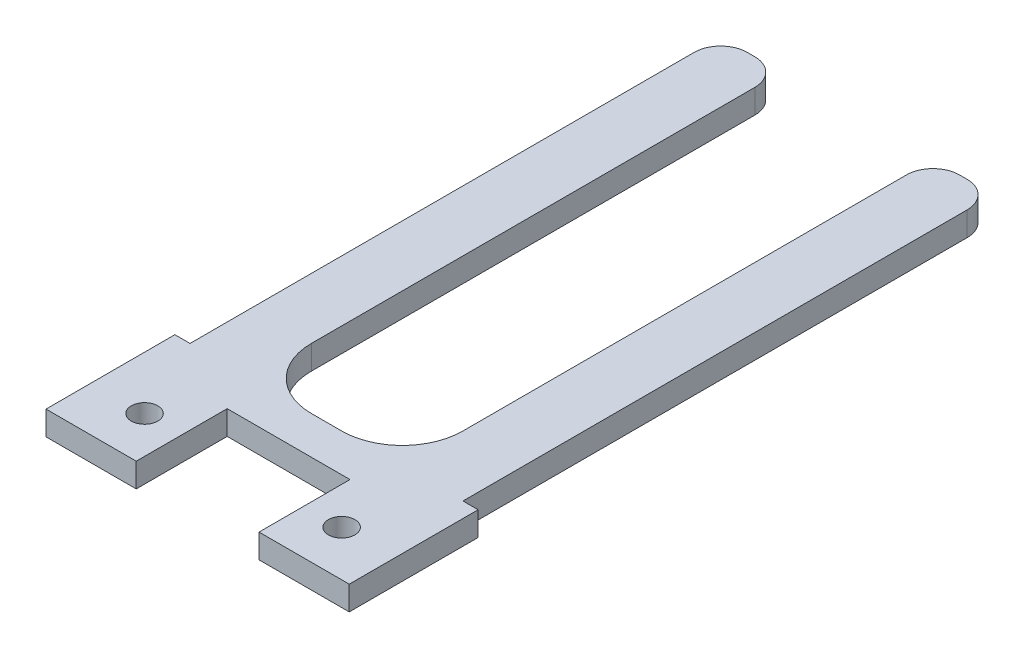
ISO-10303-21;
HEADER;
FILE_DESCRIPTION(('STEP AP214'),'2;1');
FILE_NAME('part.step','',(''),(''),'','','');
FILE_SCHEMA(('AUTOMOTIVE_DESIGN { 1 0 10303 214 1 1 1 1 }'));
ENDSEC;
DATA;
#1=APPLICATION_CONTEXT('core data for automotive mechanical design processes');
#2=APPLICATION_PROTOCOL_DEFINITION('international standard','automotive_design',2000,#1);
#3=PRODUCT_CONTEXT('',#1,'mechanical');
#4=PRODUCT('Part','Part','',(#3));
#5=PRODUCT_RELATED_PRODUCT_CATEGORY('part','',(#4));
#6=PRODUCT_DEFINITION_FORMATION('','',#4);
#7=PRODUCT_DEFINITION_CONTEXT('part definition',#1,'design');
#8=PRODUCT_DEFINITION('design','',#6,#7);
#9=PRODUCT_DEFINITION_SHAPE('','',#8);
#10=(LENGTH_UNIT() NAMED_UNIT(*) SI_UNIT(.MILLI.,.METRE.));
#11=(NAMED_UNIT(*) PLANE_ANGLE_UNIT() SI_UNIT($,.RADIAN.));
#12=(NAMED_UNIT(*) SI_UNIT($,.STERADIAN.) SOLID_ANGLE_UNIT());
#13=UNCERTAINTY_MEASURE_WITH_UNIT(LENGTH_MEASURE(1.E-05),#10,'distance_accuracy_value','');
#14=(GEOMETRIC_REPRESENTATION_CONTEXT(3) GLOBAL_UNCERTAINTY_ASSIGNED_CONTEXT((#13)) GLOBAL_UNIT_ASSIGNED_CONTEXT((#10,
#11,#12)) REPRESENTATION_CONTEXT('',''));
#15=CARTESIAN_POINT('',(0.,0.,0.));
#16=DIRECTION('',(0.,0.,1.));
#17=DIRECTION('',(1.,0.,0.));
#18=AXIS2_PLACEMENT_3D('',#15,#16,#17);
#19=CARTESIAN_POINT('',(14.5,1.5875,-71.5));
#20=DIRECTION('',(0.,-1.,0.));
#21=DIRECTION('',(0.,0.,-1.));
#22=AXIS2_PLACEMENT_3D('',#19,#20,#21);
#23=CYLINDRICAL_SURFACE('',#22,3.5);
#24=CARTESIAN_POINT('',(14.5,-1.5875,-71.5));
#25=DIRECTION('',(0.,1.,0.));
#26=DIRECTION('',(0.,0.,1.));
#27=AXIS2_PLACEMENT_3D('',#24,#25,#26);
#28=CIRCLE('',#27,3.5);
#29=CARTESIAN_POINT('',(14.5,-1.5875,-75.));
#30=VERTEX_POINT('',#29);
#31=CARTESIAN_POINT('',(18.,-1.5875,-71.5));
#32=VERTEX_POINT('',#31);
#33=EDGE_CURVE('E193',#30,#32,#28,.F.);
#34=ORIENTED_EDGE('',*,*,#33,.F.);
#35=DIRECTION('',(0.,-1.,0.));
#36=VECTOR('',#35,1.);
#37=CARTESIAN_POINT('',(14.5,1.5875,-75.));
#38=LINE('',#37,#36);
#39=CARTESIAN_POINT('',(14.5,1.5875,-75.));
#40=VERTEX_POINT('',#39);
#41=EDGE_CURVE('E188',#40,#30,#38,.T.);
#42=ORIENTED_EDGE('',*,*,#41,.F.);
#43=CARTESIAN_POINT('',(14.5,1.5875,-71.5));
#44=DIRECTION('',(0.,1.,0.));
#45=DIRECTION('',(0.,0.,1.));
#46=AXIS2_PLACEMENT_3D('',#43,#44,#45);
#47=CIRCLE('',#46,3.5);
#48=CARTESIAN_POINT('',(18.,1.5875,-71.5));
#49=VERTEX_POINT('',#48);
#50=EDGE_CURVE('E191',#40,#49,#47,.F.);
#51=ORIENTED_EDGE('',*,*,#50,.T.);
#52=DIRECTION('',(0.,-1.,0.));
#53=VECTOR('',#52,1.);
#54=CARTESIAN_POINT('',(18.,1.5875,-71.5));
#55=LINE('',#54,#53);
#56=EDGE_CURVE('E269',#49,#32,#55,.T.);
#57=ORIENTED_EDGE('',*,*,#56,.T.);
#58=EDGE_LOOP('',(#34,#42,#51,#57));
#59=FACE_BOUND('',#58,.T.);
#60=ADVANCED_FACE('F39',(#59),#23,.T.);
#61=CARTESIAN_POINT('',(0.,1.5875,-75.));
#62=DIRECTION('',(0.,0.,1.));
#63=DIRECTION('',(1.,0.,0.));
#64=AXIS2_PLACEMENT_3D('',#61,#62,#63);
#65=PLANE('',#64);
#66=DIRECTION('',(-1.,0.,0.));
#67=VECTOR('',#66,1.);
#68=CARTESIAN_POINT('',(0.,-1.5875,-75.));
#69=LINE('',#68,#67);
#70=CARTESIAN_POINT('',(13.5,-1.5875,-75.));
#71=VERTEX_POINT('',#70);
#72=EDGE_CURVE('E271',#30,#71,#69,.T.);
#73=ORIENTED_EDGE('',*,*,#72,.T.);
#74=DIRECTION('',(0.,-1.,0.));
#75=VECTOR('',#74,1.);
#76=CARTESIAN_POINT('',(13.5,1.5875,-75.));
#77=LINE('',#76,#75);
#78=CARTESIAN_POINT('',(13.5,1.5875,-75.));
#79=VERTEX_POINT('',#78);
#80=EDGE_CURVE('E198',#79,#71,#77,.T.);
#81=ORIENTED_EDGE('',*,*,#80,.F.);
#82=DIRECTION('',(-1.,0.,0.));
#83=VECTOR('',#82,1.);
#84=CARTESIAN_POINT('',(0.,1.5875,-75.));
#85=LINE('',#84,#83);
#86=EDGE_CURVE('E201',#40,#79,#85,.T.);
#87=ORIENTED_EDGE('',*,*,#86,.F.);
#88=ORIENTED_EDGE('',*,*,#41,.T.);
#89=EDGE_LOOP('',(#73,#81,#87,#88));
#90=FACE_BOUND('',#89,.T.);
#91=ADVANCED_FACE('F202',(#90),#65,.F.);
#92=CARTESIAN_POINT('',(13.5,1.5875,-71.5));
#93=DIRECTION('',(0.,-1.,0.));
#94=DIRECTION('',(0.,0.,-1.));
#95=AXIS2_PLACEMENT_3D('',#92,#93,#94);
#96=CYLINDRICAL_SURFACE('',#95,3.5);
#97=CARTESIAN_POINT('',(13.5,-1.5875,-71.5));
#98=DIRECTION('',(0.,1.,0.));
#99=DIRECTION('',(0.,0.,1.));
#100=AXIS2_PLACEMENT_3D('',#97,#98,#99);
#101=CIRCLE('',#100,3.5);
#102=CARTESIAN_POINT('',(9.99999999999998,-1.5875,-71.5));
#103=VERTEX_POINT('',#102);
#104=EDGE_CURVE('E273',#103,#71,#101,.F.);
#105=ORIENTED_EDGE('',*,*,#104,.F.);
#106=DIRECTION('',(0.,-1.,0.));
#107=VECTOR('',#106,1.);
#108=CARTESIAN_POINT('',(9.99999999999998,1.5875,-71.5));
#109=LINE('',#108,#107);
#110=CARTESIAN_POINT('',(9.99999999999998,1.5875,-71.5));
#111=VERTEX_POINT('',#110);
#112=EDGE_CURVE('E358',#111,#103,#109,.T.);
#113=ORIENTED_EDGE('',*,*,#112,.F.);
#114=CARTESIAN_POINT('',(13.5,1.5875,-71.5));
#115=DIRECTION('',(0.,1.,0.));
#116=DIRECTION('',(0.,0.,1.));
#117=AXIS2_PLACEMENT_3D('',#114,#115,#116);
#118=CIRCLE('',#117,3.5);
#119=EDGE_CURVE('E205',#111,#79,#118,.F.);
#120=ORIENTED_EDGE('',*,*,#119,.T.);
#121=ORIENTED_EDGE('',*,*,#80,.T.);
#122=EDGE_LOOP('',(#105,#113,#120,#121));
#123=FACE_BOUND('',#122,.T.);
#124=ADVANCED_FACE('F444',(#123),#96,.T.);
#125=CARTESIAN_POINT('',(9.99999999999999,1.5875,0.));
#126=DIRECTION('',(1.,0.,0.));
#127=DIRECTION('',(0.,0.,-1.));
#128=AXIS2_PLACEMENT_3D('',#125,#126,#127);
#129=PLANE('',#128);
#130=DIRECTION('',(0.,0.,1.));
#131=VECTOR('',#130,1.);
#132=CARTESIAN_POINT('',(9.99999999999999,-1.5875,0.));
#133=LINE('',#132,#131);
#134=CARTESIAN_POINT('',(9.99999999999999,-1.5875,-13.));
#135=VERTEX_POINT('',#134);
#136=EDGE_CURVE('E276',#103,#135,#133,.T.);
#137=ORIENTED_EDGE('',*,*,#136,.T.);
#138=DIRECTION('',(0.,-1.,0.));
#139=VECTOR('',#138,1.);
#140=CARTESIAN_POINT('',(9.99999999999999,1.5875,-13.));
#141=LINE('',#140,#139);
#142=CARTESIAN_POINT('',(9.99999999999999,1.5875,-13.));
#143=VERTEX_POINT('',#142);
#144=EDGE_CURVE('E365',#135,#143,#141,.F.);
#145=ORIENTED_EDGE('',*,*,#144,.T.);
#146=DIRECTION('',(0.,0.,1.));
#147=VECTOR('',#146,1.);
#148=CARTESIAN_POINT('',(9.99999999999999,1.5875,0.));
#149=LINE('',#148,#147);
#150=EDGE_CURVE('E219',#111,#143,#149,.T.);
#151=ORIENTED_EDGE('',*,*,#150,.F.);
#152=ORIENTED_EDGE('',*,*,#112,.T.);
#153=EDGE_LOOP('',(#137,#145,#151,#152));
#154=FACE_BOUND('',#153,.T.);
#155=ADVANCED_FACE('F451',(#154),#129,.F.);
#156=CARTESIAN_POINT('',(0.,1.5875,-5.00000000000001));
#157=DIRECTION('',(0.,0.,-1.));
#158=DIRECTION('',(-1.,0.,0.));
#159=AXIS2_PLACEMENT_3D('',#156,#157,#158);
#160=PLANE('',#159);
#161=DIRECTION('',(1.,0.,0.));
#162=VECTOR('',#161,1.);
#163=CARTESIAN_POINT('',(0.,1.5875,-5.00000000000001));
#164=LINE('',#163,#162);
#165=CARTESIAN_POINT('',(-1.99999999999999,1.5875,-5.00000000000001));
#166=VERTEX_POINT('',#165);
#167=CARTESIAN_POINT('',(1.99999999999999,1.5875,-5.00000000000001));
#168=VERTEX_POINT('',#167);
#169=EDGE_CURVE('E222',#166,#168,#164,.T.);
#170=ORIENTED_EDGE('',*,*,#169,.T.);
#171=DIRECTION('',(0.,-1.,0.));
#172=VECTOR('',#171,1.);
#173=CARTESIAN_POINT('',(1.99999999999999,1.5875,-5.00000000000001));
#174=LINE('',#173,#172);
#175=CARTESIAN_POINT('',(1.99999999999999,-1.5875,-5.00000000000001));
#176=VERTEX_POINT('',#175);
#177=EDGE_CURVE('E362',#168,#176,#174,.T.);
#178=ORIENTED_EDGE('',*,*,#177,.T.);
#179=DIRECTION('',(1.,0.,0.));
#180=VECTOR('',#179,1.);
#181=CARTESIAN_POINT('',(0.,-1.5875,-5.00000000000001));
#182=LINE('',#181,#180);
#183=CARTESIAN_POINT('',(-1.99999999999999,-1.5875,-5.00000000000001));
#184=VERTEX_POINT('',#183);
#185=EDGE_CURVE('E279',#184,#176,#182,.T.);
#186=ORIENTED_EDGE('',*,*,#185,.F.);
#187=DIRECTION('',(0.,-1.,0.));
#188=VECTOR('',#187,1.);
#189=CARTESIAN_POINT('',(-1.99999999999999,1.5875,-5.00000000000001));
#190=LINE('',#189,#188);
#191=EDGE_CURVE('E197',#184,#166,#190,.F.);
#192=ORIENTED_EDGE('',*,*,#191,.T.);
#193=EDGE_LOOP('',(#170,#178,#186,#192));
#194=FACE_BOUND('',#193,.T.);
#195=ADVANCED_FACE('F378',(#194),#160,.T.);
#196=CARTESIAN_POINT('',(-9.99999999999999,1.5875,0.));
#197=DIRECTION('',(1.,0.,0.));
#198=DIRECTION('',(0.,0.,-1.));
#199=AXIS2_PLACEMENT_3D('',#196,#197,#198);
#200=PLANE('',#199);
#201=DIRECTION('',(0.,0.,1.));
#202=VECTOR('',#201,1.);
#203=CARTESIAN_POINT('',(-9.99999999999999,1.5875,0.));
#204=LINE('',#203,#202);
#205=CARTESIAN_POINT('',(-9.99999999999999,1.5875,-71.5));
#206=VERTEX_POINT('',#205);
#207=CARTESIAN_POINT('',(-9.99999999999999,1.5875,-13.));
#208=VERTEX_POINT('',#207);
#209=EDGE_CURVE('E225',#206,#208,#204,.T.);
#210=ORIENTED_EDGE('',*,*,#209,.T.);
#211=DIRECTION('',(0.,-1.,0.));
#212=VECTOR('',#211,1.);
#213=CARTESIAN_POINT('',(-9.99999999999999,-1.5875,-13.));
#214=LINE('',#213,#212);
#215=CARTESIAN_POINT('',(-9.99999999999999,-1.5875,-13.));
#216=VERTEX_POINT('',#215);
#217=EDGE_CURVE('E367',#208,#216,#214,.T.);
#218=ORIENTED_EDGE('',*,*,#217,.T.);
#219=DIRECTION('',(0.,0.,1.));
#220=VECTOR('',#219,1.);
#221=CARTESIAN_POINT('',(-9.99999999999999,-1.5875,0.));
#222=LINE('',#221,#220);
#223=CARTESIAN_POINT('',(-9.99999999999999,-1.5875,-71.5));
#224=VERTEX_POINT('',#223);
#225=EDGE_CURVE('E282',#224,#216,#222,.T.);
#226=ORIENTED_EDGE('',*,*,#225,.F.);
#227=DIRECTION('',(0.,-1.,0.));
#228=VECTOR('',#227,1.);
#229=CARTESIAN_POINT('',(-9.99999999999999,1.5875,-71.5));
#230=LINE('',#229,#228);
#231=EDGE_CURVE('E356',#206,#224,#230,.T.);
#232=ORIENTED_EDGE('',*,*,#231,.F.);
#233=EDGE_LOOP('',(#210,#218,#226,#232));
#234=FACE_BOUND('',#233,.T.);
#235=ADVANCED_FACE('F381',(#234),#200,.T.);
#236=CARTESIAN_POINT('',(-13.5,1.5875,-71.5));
#237=DIRECTION('',(0.,-1.,0.));
#238=DIRECTION('',(0.,0.,-1.));
#239=AXIS2_PLACEMENT_3D('',#236,#237,#238);
#240=CYLINDRICAL_SURFACE('',#239,3.5);
#241=CARTESIAN_POINT('',(-13.5,-1.5875,-71.5));
#242=DIRECTION('',(0.,1.,0.));
#243=DIRECTION('',(0.,0.,1.));
#244=AXIS2_PLACEMENT_3D('',#241,#242,#243);
#245=CIRCLE('',#244,3.5);
#246=CARTESIAN_POINT('',(-13.5,-1.5875,-75.));
#247=VERTEX_POINT('',#246);
#248=EDGE_CURVE('E285',#247,#224,#245,.F.);
#249=ORIENTED_EDGE('',*,*,#248,.F.);
#250=DIRECTION('',(0.,-1.,0.));
#251=VECTOR('',#250,1.);
#252=CARTESIAN_POINT('',(-13.5,1.5875,-75.));
#253=LINE('',#252,#251);
#254=CARTESIAN_POINT('',(-13.5,1.5875,-75.));
#255=VERTEX_POINT('',#254);
#256=EDGE_CURVE('E354',#255,#247,#253,.T.);
#257=ORIENTED_EDGE('',*,*,#256,.F.);
#258=CARTESIAN_POINT('',(-13.5,1.5875,-71.5));
#259=DIRECTION('',(0.,1.,0.));
#260=DIRECTION('',(0.,0.,1.));
#261=AXIS2_PLACEMENT_3D('',#258,#259,#260);
#262=CIRCLE('',#261,3.5);
#263=EDGE_CURVE('E227',#255,#206,#262,.F.);
#264=ORIENTED_EDGE('',*,*,#263,.T.);
#265=ORIENTED_EDGE('',*,*,#231,.T.);
#266=EDGE_LOOP('',(#249,#257,#264,#265));
#267=FACE_BOUND('',#266,.T.);
#268=ADVANCED_FACE('F386',(#267),#240,.T.);
#269=CARTESIAN_POINT('',(0.,1.5875,-75.));
#270=DIRECTION('',(0.,0.,-1.));
#271=DIRECTION('',(-1.,0.,0.));
#272=AXIS2_PLACEMENT_3D('',#269,#270,#271);
#273=PLANE('',#272);
#274=DIRECTION('',(1.,0.,0.));
#275=VECTOR('',#274,1.);
#276=CARTESIAN_POINT('',(0.,-1.5875,-75.));
#277=LINE('',#276,#275);
#278=CARTESIAN_POINT('',(-14.5,-1.5875,-75.));
#279=VERTEX_POINT('',#278);
#280=EDGE_CURVE('E288',#279,#247,#277,.T.);
#281=ORIENTED_EDGE('',*,*,#280,.F.);
#282=DIRECTION('',(0.,-1.,0.));
#283=VECTOR('',#282,1.);
#284=CARTESIAN_POINT('',(-14.5,1.5875,-75.));
#285=LINE('',#284,#283);
#286=CARTESIAN_POINT('',(-14.5,1.5875,-75.));
#287=VERTEX_POINT('',#286);
#288=EDGE_CURVE('E352',#287,#279,#285,.T.);
#289=ORIENTED_EDGE('',*,*,#288,.F.);
#290=DIRECTION('',(1.,0.,0.));
#291=VECTOR('',#290,1.);
#292=CARTESIAN_POINT('',(0.,1.5875,-75.));
#293=LINE('',#292,#291);
#294=EDGE_CURVE('E230',#287,#255,#293,.T.);
#295=ORIENTED_EDGE('',*,*,#294,.T.);
#296=ORIENTED_EDGE('',*,*,#256,.T.);
#297=EDGE_LOOP('',(#281,#289,#295,#296));
#298=FACE_BOUND('',#297,.T.);
#299=ADVANCED_FACE('F389',(#298),#273,.T.);
#300=CARTESIAN_POINT('',(-14.5,1.5875,-71.5));
#301=DIRECTION('',(0.,-1.,0.));
#302=DIRECTION('',(0.,0.,-1.));
#303=AXIS2_PLACEMENT_3D('',#300,#301,#302);
#304=CYLINDRICAL_SURFACE('',#303,3.5);
#305=CARTESIAN_POINT('',(-14.5,-1.5875,-71.5));
#306=DIRECTION('',(0.,1.,0.));
#307=DIRECTION('',(0.,0.,1.));
#308=AXIS2_PLACEMENT_3D('',#305,#306,#307);
#309=CIRCLE('',#308,3.5);
#310=CARTESIAN_POINT('',(-18.,-1.5875,-71.5));
#311=VERTEX_POINT('',#310);
#312=EDGE_CURVE('E291',#311,#279,#309,.F.);
#313=ORIENTED_EDGE('',*,*,#312,.F.);
#314=DIRECTION('',(0.,-1.,0.));
#315=VECTOR('',#314,1.);
#316=CARTESIAN_POINT('',(-18.,1.5875,-71.5));
#317=LINE('',#316,#315);
#318=CARTESIAN_POINT('',(-18.,1.5875,-71.5));
#319=VERTEX_POINT('',#318);
#320=EDGE_CURVE('E350',#319,#311,#317,.T.);
#321=ORIENTED_EDGE('',*,*,#320,.F.);
#322=CARTESIAN_POINT('',(-14.5,1.5875,-71.5));
#323=DIRECTION('',(0.,1.,0.));
#324=DIRECTION('',(0.,0.,1.));
#325=AXIS2_PLACEMENT_3D('',#322,#323,#324);
#326=CIRCLE('',#325,3.5);
#327=EDGE_CURVE('E233',#319,#287,#326,.F.);
#328=ORIENTED_EDGE('',*,*,#327,.T.);
#329=ORIENTED_EDGE('',*,*,#288,.T.);
#330=EDGE_LOOP('',(#313,#321,#328,#329));
#331=FACE_BOUND('',#330,.T.);
#332=ADVANCED_FACE('F394',(#331),#304,.T.);
#333=CARTESIAN_POINT('',(-18.,1.5875,0.));
#334=DIRECTION('',(-1.,0.,0.));
#335=DIRECTION('',(0.,0.,1.));
#336=AXIS2_PLACEMENT_3D('',#333,#334,#335);
#337=PLANE('',#336);
#338=DIRECTION('',(0.,0.,-1.));
#339=VECTOR('',#338,1.);
#340=CARTESIAN_POINT('',(-18.,-1.5875,0.));
#341=LINE('',#340,#339);
#342=CARTESIAN_POINT('',(-18.,-1.5875,-5.));
#343=VERTEX_POINT('',#342);
#344=EDGE_CURVE('E294',#343,#311,#341,.T.);
#345=ORIENTED_EDGE('',*,*,#344,.F.);
#346=DIRECTION('',(0.,-1.,0.));
#347=VECTOR('',#346,1.);
#348=CARTESIAN_POINT('',(-18.,1.5875,-5.));
#349=LINE('',#348,#347);
#350=CARTESIAN_POINT('',(-18.,1.5875,-5.));
#351=VERTEX_POINT('',#350);
#352=EDGE_CURVE('E348',#351,#343,#349,.T.);
#353=ORIENTED_EDGE('',*,*,#352,.F.);
#354=DIRECTION('',(0.,0.,-1.));
#355=VECTOR('',#354,1.);
#356=CARTESIAN_POINT('',(-18.,1.5875,0.));
#357=LINE('',#356,#355);
#358=EDGE_CURVE('E236',#351,#319,#357,.T.);
#359=ORIENTED_EDGE('',*,*,#358,.T.);
#360=ORIENTED_EDGE('',*,*,#320,.T.);
#361=EDGE_LOOP('',(#345,#353,#359,#360));
#362=FACE_BOUND('',#361,.T.);
#363=ADVANCED_FACE('F397',(#362),#337,.T.);
#364=CARTESIAN_POINT('',(0.,1.5875,-4.99999999999999));
#365=DIRECTION('',(0.,0.,-1.));
#366=DIRECTION('',(-1.,0.,0.));
#367=AXIS2_PLACEMENT_3D('',#364,#365,#366);
#368=PLANE('',#367);
#369=DIRECTION('',(1.,0.,0.));
#370=VECTOR('',#369,1.);
#371=CARTESIAN_POINT('',(0.,-1.5875,-4.99999999999999));
#372=LINE('',#371,#370);
#373=CARTESIAN_POINT('',(-20.,-1.5875,-5.));
#374=VERTEX_POINT('',#373);
#375=EDGE_CURVE('E297',#374,#343,#372,.T.);
#376=ORIENTED_EDGE('',*,*,#375,.F.);
#377=DIRECTION('',(0.,-1.,0.));
#378=VECTOR('',#377,1.);
#379=CARTESIAN_POINT('',(-20.,1.5875,-5.));
#380=LINE('',#379,#378);
#381=CARTESIAN_POINT('',(-20.,1.5875,-5.));
#382=VERTEX_POINT('',#381);
#383=EDGE_CURVE('E346',#382,#374,#380,.T.);
#384=ORIENTED_EDGE('',*,*,#383,.F.);
#385=DIRECTION('',(1.,0.,0.));
#386=VECTOR('',#385,1.);
#387=CARTESIAN_POINT('',(0.,1.5875,-4.99999999999999));
#388=LINE('',#387,#386);
#389=EDGE_CURVE('E239',#382,#351,#388,.T.);
#390=ORIENTED_EDGE('',*,*,#389,.T.);
#391=ORIENTED_EDGE('',*,*,#352,.T.);
#392=EDGE_LOOP('',(#376,#384,#390,#391));
#393=FACE_BOUND('',#392,.T.);
#394=ADVANCED_FACE('F402',(#393),#368,.T.);
#395=CARTESIAN_POINT('',(-20.,1.5875,0.));
#396=DIRECTION('',(-1.,0.,0.));
#397=DIRECTION('',(0.,0.,1.));
#398=AXIS2_PLACEMENT_3D('',#395,#396,#397);
#399=PLANE('',#398);
#400=DIRECTION('',(0.,0.,-1.));
#401=VECTOR('',#400,1.);
#402=CARTESIAN_POINT('',(-20.,-1.5875,0.));
#403=LINE('',#402,#401);
#404=CARTESIAN_POINT('',(-20.,-1.5875,12.));
#405=VERTEX_POINT('',#404);
#406=EDGE_CURVE('E300',#405,#374,#403,.T.);
#407=ORIENTED_EDGE('',*,*,#406,.F.);
#408=DIRECTION('',(0.,-1.,0.));
#409=VECTOR('',#408,1.);
#410=CARTESIAN_POINT('',(-20.,1.5875,12.));
#411=LINE('',#410,#409);
#412=CARTESIAN_POINT('',(-20.,1.5875,12.));
#413=VERTEX_POINT('',#412);
#414=EDGE_CURVE('E344',#413,#405,#411,.T.);
#415=ORIENTED_EDGE('',*,*,#414,.F.);
#416=DIRECTION('',(0.,0.,-1.));
#417=VECTOR('',#416,1.);
#418=CARTESIAN_POINT('',(-20.,1.5875,0.));
#419=LINE('',#418,#417);
#420=EDGE_CURVE('E242',#413,#382,#419,.T.);
#421=ORIENTED_EDGE('',*,*,#420,.T.);
#422=ORIENTED_EDGE('',*,*,#383,.T.);
#423=EDGE_LOOP('',(#407,#415,#421,#422));
#424=FACE_BOUND('',#423,.T.);
#425=ADVANCED_FACE('F405',(#424),#399,.T.);
#426=CARTESIAN_POINT('',(0.,1.5875,12.));
#427=DIRECTION('',(0.,0.,1.));
#428=DIRECTION('',(1.,0.,0.));
#429=AXIS2_PLACEMENT_3D('',#426,#427,#428);
#430=PLANE('',#429);
#431=DIRECTION('',(-1.,0.,0.));
#432=VECTOR('',#431,1.);
#433=CARTESIAN_POINT('',(0.,-1.5875,12.));
#434=LINE('',#433,#432);
#435=CARTESIAN_POINT('',(-8.1,-1.5875,12.));
#436=VERTEX_POINT('',#435);
#437=EDGE_CURVE('E303',#436,#405,#434,.T.);
#438=ORIENTED_EDGE('',*,*,#437,.F.);
#439=DIRECTION('',(0.,-1.,0.));
#440=VECTOR('',#439,1.);
#441=CARTESIAN_POINT('',(-8.1,1.5875,12.));
#442=LINE('',#441,#440);
#443=CARTESIAN_POINT('',(-8.1,1.5875,12.));
#444=VERTEX_POINT('',#443);
#445=EDGE_CURVE('E342',#444,#436,#442,.T.);
#446=ORIENTED_EDGE('',*,*,#445,.F.);
#447=DIRECTION('',(-1.,0.,0.));
#448=VECTOR('',#447,1.);
#449=CARTESIAN_POINT('',(0.,1.5875,12.));
#450=LINE('',#449,#448);
#451=EDGE_CURVE('E245',#444,#413,#450,.T.);
#452=ORIENTED_EDGE('',*,*,#451,.T.);
#453=ORIENTED_EDGE('',*,*,#414,.T.);
#454=EDGE_LOOP('',(#438,#446,#452,#453));
#455=FACE_BOUND('',#454,.T.);
#456=ADVANCED_FACE('F410',(#455),#430,.T.);
#457=CARTESIAN_POINT('',(-8.1,1.5875,0.));
#458=DIRECTION('',(1.,0.,0.));
#459=DIRECTION('',(0.,0.,-1.));
#460=AXIS2_PLACEMENT_3D('',#457,#458,#459);
#461=PLANE('',#460);
#462=DIRECTION('',(0.,0.,1.));
#463=VECTOR('',#462,1.);
#464=CARTESIAN_POINT('',(-8.1,-1.5875,0.));
#465=LINE('',#464,#463);
#466=CARTESIAN_POINT('',(-8.1,-1.5875,0.));
#467=VERTEX_POINT('',#466);
#468=EDGE_CURVE('E306',#467,#436,#465,.T.);
#469=ORIENTED_EDGE('',*,*,#468,.F.);
#470=DIRECTION('',(0.,-1.,0.));
#471=VECTOR('',#470,1.);
#472=CARTESIAN_POINT('',(-8.1,1.5875,0.));
#473=LINE('',#472,#471);
#474=CARTESIAN_POINT('',(-8.1,1.5875,0.));
#475=VERTEX_POINT('',#474);
#476=EDGE_CURVE('E340',#475,#467,#473,.T.);
#477=ORIENTED_EDGE('',*,*,#476,.F.);
#478=DIRECTION('',(0.,0.,1.));
#479=VECTOR('',#478,1.);
#480=CARTESIAN_POINT('',(-8.1,1.5875,0.));
#481=LINE('',#480,#479);
#482=EDGE_CURVE('E248',#475,#444,#481,.T.);
#483=ORIENTED_EDGE('',*,*,#482,.T.);
#484=ORIENTED_EDGE('',*,*,#445,.T.);
#485=EDGE_LOOP('',(#469,#477,#483,#484));
#486=FACE_BOUND('',#485,.T.);
#487=ADVANCED_FACE('F413',(#486),#461,.T.);
#488=CARTESIAN_POINT('',(0.,1.5875,0.));
#489=DIRECTION('',(0.,0.,1.));
#490=DIRECTION('',(1.,0.,0.));
#491=AXIS2_PLACEMENT_3D('',#488,#489,#490);
#492=PLANE('',#491);
#493=DIRECTION('',(-1.,0.,0.));
#494=VECTOR('',#493,1.);
#495=CARTESIAN_POINT('',(0.,-1.5875,0.));
#496=LINE('',#495,#494);
#497=CARTESIAN_POINT('',(8.1,-1.5875,0.));
#498=VERTEX_POINT('',#497);
#499=EDGE_CURVE('E309',#498,#467,#496,.T.);
#500=ORIENTED_EDGE('',*,*,#499,.F.);
#501=DIRECTION('',(0.,-1.,0.));
#502=VECTOR('',#501,1.);
#503=CARTESIAN_POINT('',(8.1,1.5875,0.));
#504=LINE('',#503,#502);
#505=CARTESIAN_POINT('',(8.1,1.5875,0.));
#506=VERTEX_POINT('',#505);
#507=EDGE_CURVE('E338',#506,#498,#504,.T.);
#508=ORIENTED_EDGE('',*,*,#507,.F.);
#509=DIRECTION('',(-1.,0.,0.));
#510=VECTOR('',#509,1.);
#511=CARTESIAN_POINT('',(0.,1.5875,0.));
#512=LINE('',#511,#510);
#513=EDGE_CURVE('E251',#506,#475,#512,.T.);
#514=ORIENTED_EDGE('',*,*,#513,.T.);
#515=ORIENTED_EDGE('',*,*,#476,.T.);
#516=EDGE_LOOP('',(#500,#508,#514,#515));
#517=FACE_BOUND('',#516,.T.);
#518=ADVANCED_FACE('F417',(#517),#492,.T.);
#519=CARTESIAN_POINT('',(8.1,1.5875,0.));
#520=DIRECTION('',(1.,0.,0.));
#521=DIRECTION('',(0.,0.,-1.));
#522=AXIS2_PLACEMENT_3D('',#519,#520,#521);
#523=PLANE('',#522);
#524=DIRECTION('',(0.,0.,1.));
#525=VECTOR('',#524,1.);
#526=CARTESIAN_POINT('',(8.1,-1.5875,0.));
#527=LINE('',#526,#525);
#528=CARTESIAN_POINT('',(8.1,-1.5875,12.));
#529=VERTEX_POINT('',#528);
#530=EDGE_CURVE('E312',#498,#529,#527,.T.);
#531=ORIENTED_EDGE('',*,*,#530,.T.);
#532=DIRECTION('',(0.,-1.,0.));
#533=VECTOR('',#532,1.);
#534=CARTESIAN_POINT('',(8.1,1.5875,12.));
#535=LINE('',#534,#533);
#536=CARTESIAN_POINT('',(8.1,1.5875,12.));
#537=VERTEX_POINT('',#536);
#538=EDGE_CURVE('E335',#537,#529,#535,.T.);
#539=ORIENTED_EDGE('',*,*,#538,.F.);
#540=DIRECTION('',(0.,0.,1.));
#541=VECTOR('',#540,1.);
#542=CARTESIAN_POINT('',(8.1,1.5875,0.));
#543=LINE('',#542,#541);
#544=EDGE_CURVE('E254',#506,#537,#543,.T.);
#545=ORIENTED_EDGE('',*,*,#544,.F.);
#546=ORIENTED_EDGE('',*,*,#507,.T.);
#547=EDGE_LOOP('',(#531,#539,#545,#546));
#548=FACE_BOUND('',#547,.T.);
#549=ADVANCED_FACE('F422',(#548),#523,.F.);
#550=CARTESIAN_POINT('',(0.,1.5875,12.));
#551=DIRECTION('',(0.,0.,-1.));
#552=DIRECTION('',(-1.,0.,0.));
#553=AXIS2_PLACEMENT_3D('',#550,#551,#552);
#554=PLANE('',#553);
#555=DIRECTION('',(1.,0.,0.));
#556=VECTOR('',#555,1.);
#557=CARTESIAN_POINT('',(0.,-1.5875,12.));
#558=LINE('',#557,#556);
#559=CARTESIAN_POINT('',(20.,-1.5875,12.));
#560=VERTEX_POINT('',#559);
#561=EDGE_CURVE('E314',#529,#560,#558,.T.);
#562=ORIENTED_EDGE('',*,*,#561,.T.);
#563=DIRECTION('',(0.,-1.,0.));
#564=VECTOR('',#563,1.);
#565=CARTESIAN_POINT('',(20.,1.5875,12.));
#566=LINE('',#565,#564);
#567=CARTESIAN_POINT('',(20.,1.5875,12.));
#568=VERTEX_POINT('',#567);
#569=EDGE_CURVE('E332',#568,#560,#566,.T.);
#570=ORIENTED_EDGE('',*,*,#569,.F.);
#571=DIRECTION('',(1.,0.,0.));
#572=VECTOR('',#571,1.);
#573=CARTESIAN_POINT('',(0.,1.5875,12.));
#574=LINE('',#573,#572);
#575=EDGE_CURVE('E256',#537,#568,#574,.T.);
#576=ORIENTED_EDGE('',*,*,#575,.F.);
#577=ORIENTED_EDGE('',*,*,#538,.T.);
#578=EDGE_LOOP('',(#562,#570,#576,#577));
#579=FACE_BOUND('',#578,.T.);
#580=ADVANCED_FACE('F428',(#579),#554,.F.);
#581=CARTESIAN_POINT('',(20.,1.5875,0.));
#582=DIRECTION('',(-1.,0.,0.));
#583=DIRECTION('',(0.,0.,1.));
#584=AXIS2_PLACEMENT_3D('',#581,#582,#583);
#585=PLANE('',#584);
#586=DIRECTION('',(0.,0.,-1.));
#587=VECTOR('',#586,1.);
#588=CARTESIAN_POINT('',(20.,-1.5875,0.));
#589=LINE('',#588,#587);
#590=CARTESIAN_POINT('',(20.,-1.5875,-5.));
#591=VERTEX_POINT('',#590);
#592=EDGE_CURVE('E316',#560,#591,#589,.T.);
#593=ORIENTED_EDGE('',*,*,#592,.T.);
#594=DIRECTION('',(0.,-1.,0.));
#595=VECTOR('',#594,1.);
#596=CARTESIAN_POINT('',(20.,1.5875,-5.));
#597=LINE('',#596,#595);
#598=CARTESIAN_POINT('',(20.,1.5875,-5.));
#599=VERTEX_POINT('',#598);
#600=EDGE_CURVE('E329',#599,#591,#597,.T.);
#601=ORIENTED_EDGE('',*,*,#600,.F.);
#602=DIRECTION('',(0.,0.,-1.));
#603=VECTOR('',#602,1.);
#604=CARTESIAN_POINT('',(20.,1.5875,0.));
#605=LINE('',#604,#603);
#606=EDGE_CURVE('E258',#568,#599,#605,.T.);
#607=ORIENTED_EDGE('',*,*,#606,.F.);
#608=ORIENTED_EDGE('',*,*,#569,.T.);
#609=EDGE_LOOP('',(#593,#601,#607,#608));
#610=FACE_BOUND('',#609,.T.);
#611=ADVANCED_FACE('F432',(#610),#585,.F.);
#612=CARTESIAN_POINT('',(0.,1.5875,-5.00000000000004));
#613=DIRECTION('',(0.,0.,1.));
#614=DIRECTION('',(1.,0.,0.));
#615=AXIS2_PLACEMENT_3D('',#612,#613,#614);
#616=PLANE('',#615);
#617=DIRECTION('',(-1.,0.,0.));
#618=VECTOR('',#617,1.);
#619=CARTESIAN_POINT('',(0.,-1.5875,-5.00000000000004));
#620=LINE('',#619,#618);
#621=CARTESIAN_POINT('',(18.,-1.5875,-5.));
#622=VERTEX_POINT('',#621);
#623=EDGE_CURVE('E318',#591,#622,#620,.T.);
#624=ORIENTED_EDGE('',*,*,#623,.T.);
#625=DIRECTION('',(0.,-1.,0.));
#626=VECTOR('',#625,1.);
#627=CARTESIAN_POINT('',(18.,1.5875,-5.));
#628=LINE('',#627,#626);
#629=CARTESIAN_POINT('',(18.,1.5875,-5.));
#630=VERTEX_POINT('',#629);
#631=EDGE_CURVE('E326',#630,#622,#628,.T.);
#632=ORIENTED_EDGE('',*,*,#631,.F.);
#633=DIRECTION('',(-1.,0.,0.));
#634=VECTOR('',#633,1.);
#635=CARTESIAN_POINT('',(0.,1.5875,-5.00000000000004));
#636=LINE('',#635,#634);
#637=EDGE_CURVE('E260',#599,#630,#636,.T.);
#638=ORIENTED_EDGE('',*,*,#637,.F.);
#639=ORIENTED_EDGE('',*,*,#600,.T.);
#640=EDGE_LOOP('',(#624,#632,#638,#639));
#641=FACE_BOUND('',#640,.T.);
#642=ADVANCED_FACE('F437',(#641),#616,.F.);
#643=CARTESIAN_POINT('',(13.,1.5875,6.));
#644=DIRECTION('',(0.,-1.,0.));
#645=DIRECTION('',(0.,0.,-1.));
#646=AXIS2_PLACEMENT_3D('',#643,#644,#645);
#647=CYLINDRICAL_SURFACE('',#646,1.75);
#648=CARTESIAN_POINT('',(13.,1.5875,6.));
#649=DIRECTION('',(0.,1.,0.));
#650=DIRECTION('',(0.,0.,1.));
#651=AXIS2_PLACEMENT_3D('',#648,#649,#650);
#652=CIRCLE('',#651,1.75);
#653=CARTESIAN_POINT('',(13.,1.5875,7.75));
#654=VERTEX_POINT('',#653);
#655=EDGE_CURVE('E263',#654,#654,#652,.F.);
#656=ORIENTED_EDGE('',*,*,#655,.F.);
#657=EDGE_LOOP('',(#656));
#658=FACE_BOUND('',#657,.T.);
#659=CARTESIAN_POINT('',(13.,-1.5875,6.));
#660=DIRECTION('',(0.,1.,0.));
#661=DIRECTION('',(0.,0.,1.));
#662=AXIS2_PLACEMENT_3D('',#659,#660,#661);
#663=CIRCLE('',#662,1.75);
#664=CARTESIAN_POINT('',(13.,-1.5875,7.75));
#665=VERTEX_POINT('',#664);
#666=EDGE_CURVE('E215',#665,#665,#663,.F.);
#667=ORIENTED_EDGE('',*,*,#666,.T.);
#668=EDGE_LOOP('',(#667));
#669=FACE_BOUND('',#668,.T.);
#670=ADVANCED_FACE('F481',(#658,#669),#647,.F.);
#671=CARTESIAN_POINT('',(18.,1.5875,0.));
#672=DIRECTION('',(-1.,0.,0.));
#673=DIRECTION('',(0.,0.,1.));
#674=AXIS2_PLACEMENT_3D('',#671,#672,#673);
#675=PLANE('',#674);
#676=DIRECTION('',(0.,0.,-1.));
#677=VECTOR('',#676,1.);
#678=CARTESIAN_POINT('',(18.,-1.5875,0.));
#679=LINE('',#678,#677);
#680=EDGE_CURVE('E320',#622,#32,#679,.T.);
#681=ORIENTED_EDGE('',*,*,#680,.T.);
#682=ORIENTED_EDGE('',*,*,#56,.F.);
#683=DIRECTION('',(0.,0.,-1.));
#684=VECTOR('',#683,1.);
#685=CARTESIAN_POINT('',(18.,1.5875,0.));
#686=LINE('',#685,#684);
#687=EDGE_CURVE('E210',#630,#49,#686,.T.);
#688=ORIENTED_EDGE('',*,*,#687,.F.);
#689=ORIENTED_EDGE('',*,*,#631,.T.);
#690=EDGE_LOOP('',(#681,#682,#688,#689));
#691=FACE_BOUND('',#690,.T.);
#692=ADVANCED_FACE('F440',(#691),#675,.F.);
#693=CARTESIAN_POINT('',(-13.,1.5875,6.));
#694=DIRECTION('',(0.,-1.,0.));
#695=DIRECTION('',(0.,0.,-1.));
#696=AXIS2_PLACEMENT_3D('',#693,#694,#695);
#697=CYLINDRICAL_SURFACE('',#696,1.75);
#698=CARTESIAN_POINT('',(-13.,1.5875,6.));
#699=DIRECTION('',(0.,1.,0.));
#700=DIRECTION('',(0.,0.,1.));
#701=AXIS2_PLACEMENT_3D('',#698,#699,#700);
#702=CIRCLE('',#701,1.75);
#703=CARTESIAN_POINT('',(-13.,1.5875,7.75));
#704=VERTEX_POINT('',#703);
#705=EDGE_CURVE('E266',#704,#704,#702,.T.);
#706=ORIENTED_EDGE('',*,*,#705,.T.);
#707=EDGE_LOOP('',(#706));
#708=FACE_BOUND('',#707,.T.);
#709=CARTESIAN_POINT('',(-13.,-1.5875,6.));
#710=DIRECTION('',(0.,1.,0.));
#711=DIRECTION('',(0.,0.,1.));
#712=AXIS2_PLACEMENT_3D('',#709,#710,#711);
#713=CIRCLE('',#712,1.75);
#714=CARTESIAN_POINT('',(-13.,-1.5875,7.75));
#715=VERTEX_POINT('',#714);
#716=EDGE_CURVE('E212',#715,#715,#713,.T.);
#717=ORIENTED_EDGE('',*,*,#716,.F.);
#718=EDGE_LOOP('',(#717));
#719=FACE_BOUND('',#718,.T.);
#720=ADVANCED_FACE('F475',(#708,#719),#697,.F.);
#721=CARTESIAN_POINT('',(0.,1.5875,0.));
#722=DIRECTION('',(0.,1.,0.));
#723=DIRECTION('',(0.,0.,1.));
#724=AXIS2_PLACEMENT_3D('',#721,#722,#723);
#725=PLANE('',#724);
#726=ORIENTED_EDGE('',*,*,#50,.F.);
#727=ORIENTED_EDGE('',*,*,#86,.T.);
#728=ORIENTED_EDGE('',*,*,#119,.F.);
#729=ORIENTED_EDGE('',*,*,#150,.T.);
#730=CARTESIAN_POINT('',(1.99999999999999,1.5875,-13.));
#731=DIRECTION('',(0.,1.,0.));
#732=DIRECTION('',(0.,0.,1.));
#733=AXIS2_PLACEMENT_3D('',#730,#731,#732);
#734=CIRCLE('',#733,8.);
#735=EDGE_CURVE('E371',#143,#168,#734,.F.);
#736=ORIENTED_EDGE('',*,*,#735,.T.);
#737=ORIENTED_EDGE('',*,*,#169,.F.);
#738=CARTESIAN_POINT('',(-1.99999999999999,1.5875,-13.));
#739=DIRECTION('',(0.,1.,0.));
#740=DIRECTION('',(0.,0.,1.));
#741=AXIS2_PLACEMENT_3D('',#738,#739,#740);
#742=CIRCLE('',#741,8.);
#743=EDGE_CURVE('E11',#166,#208,#742,.F.);
#744=ORIENTED_EDGE('',*,*,#743,.T.);
#745=ORIENTED_EDGE('',*,*,#209,.F.);
#746=ORIENTED_EDGE('',*,*,#263,.F.);
#747=ORIENTED_EDGE('',*,*,#294,.F.);
#748=ORIENTED_EDGE('',*,*,#327,.F.);
#749=ORIENTED_EDGE('',*,*,#358,.F.);
#750=ORIENTED_EDGE('',*,*,#389,.F.);
#751=ORIENTED_EDGE('',*,*,#420,.F.);
#752=ORIENTED_EDGE('',*,*,#451,.F.);
#753=ORIENTED_EDGE('',*,*,#482,.F.);
#754=ORIENTED_EDGE('',*,*,#513,.F.);
#755=ORIENTED_EDGE('',*,*,#544,.T.);
#756=ORIENTED_EDGE('',*,*,#575,.T.);
#757=ORIENTED_EDGE('',*,*,#606,.T.);
#758=ORIENTED_EDGE('',*,*,#637,.T.);
#759=ORIENTED_EDGE('',*,*,#687,.T.);
#760=EDGE_LOOP('',(#726,#727,#728,#729,#736,#737,#744,#745,#746,#747,#748,#749,#750,#751,#752,
#753,#754,#755,#756,#757,#758,#759));
#761=FACE_BOUND('',#760,.T.);
#762=ORIENTED_EDGE('',*,*,#655,.T.);
#763=EDGE_LOOP('',(#762));
#764=FACE_BOUND('',#763,.T.);
#765=ORIENTED_EDGE('',*,*,#705,.F.);
#766=EDGE_LOOP('',(#765));
#767=FACE_BOUND('',#766,.T.);
#768=ADVANCED_FACE('F207',(#761,#764,#767),#725,.T.);
#769=CARTESIAN_POINT('',(0.,-1.5875,0.));
#770=DIRECTION('',(0.,1.,0.));
#771=DIRECTION('',(0.,0.,1.));
#772=AXIS2_PLACEMENT_3D('',#769,#770,#771);
#773=PLANE('',#772);
#774=ORIENTED_EDGE('',*,*,#33,.T.);
#775=ORIENTED_EDGE('',*,*,#680,.F.);
#776=ORIENTED_EDGE('',*,*,#623,.F.);
#777=ORIENTED_EDGE('',*,*,#592,.F.);
#778=ORIENTED_EDGE('',*,*,#561,.F.);
#779=ORIENTED_EDGE('',*,*,#530,.F.);
#780=ORIENTED_EDGE('',*,*,#499,.T.);
#781=ORIENTED_EDGE('',*,*,#468,.T.);
#782=ORIENTED_EDGE('',*,*,#437,.T.);
#783=ORIENTED_EDGE('',*,*,#406,.T.);
#784=ORIENTED_EDGE('',*,*,#375,.T.);
#785=ORIENTED_EDGE('',*,*,#344,.T.);
#786=ORIENTED_EDGE('',*,*,#312,.T.);
#787=ORIENTED_EDGE('',*,*,#280,.T.);
#788=ORIENTED_EDGE('',*,*,#248,.T.);
#789=ORIENTED_EDGE('',*,*,#225,.T.);
#790=CARTESIAN_POINT('',(-1.99999999999999,-1.5875,-13.));
#791=DIRECTION('',(0.,1.,0.));
#792=DIRECTION('',(0.,0.,1.));
#793=AXIS2_PLACEMENT_3D('',#790,#791,#792);
#794=CIRCLE('',#793,8.);
#795=EDGE_CURVE('E47',#216,#184,#794,.T.);
#796=ORIENTED_EDGE('',*,*,#795,.T.);
#797=ORIENTED_EDGE('',*,*,#185,.T.);
#798=CARTESIAN_POINT('',(1.99999999999999,-1.5875,-13.));
#799=DIRECTION('',(0.,1.,0.));
#800=DIRECTION('',(0.,0.,1.));
#801=AXIS2_PLACEMENT_3D('',#798,#799,#800);
#802=CIRCLE('',#801,8.);
#803=EDGE_CURVE('E369',#176,#135,#802,.T.);
#804=ORIENTED_EDGE('',*,*,#803,.T.);
#805=ORIENTED_EDGE('',*,*,#136,.F.);
#806=ORIENTED_EDGE('',*,*,#104,.T.);
#807=ORIENTED_EDGE('',*,*,#72,.F.);
#808=EDGE_LOOP('',(#774,#775,#776,#777,#778,#779,#780,#781,#782,#783,#784,#785,#786,#787,#788,
#789,#796,#797,#804,#805,#806,#807));
#809=FACE_BOUND('',#808,.T.);
#810=ORIENTED_EDGE('',*,*,#666,.F.);
#811=EDGE_LOOP('',(#810));
#812=FACE_BOUND('',#811,.T.);
#813=ORIENTED_EDGE('',*,*,#716,.T.);
#814=EDGE_LOOP('',(#813));
#815=FACE_BOUND('',#814,.T.);
#816=ADVANCED_FACE('F374',(#809,#812,#815),#773,.F.);
#817=CARTESIAN_POINT('',(1.99999999999999,1.5875,-13.));
#818=DIRECTION('',(0.,-1.,0.));
#819=DIRECTION('',(0.,0.,-1.));
#820=AXIS2_PLACEMENT_3D('',#817,#818,#819);
#821=CYLINDRICAL_SURFACE('',#820,8.);
#822=ORIENTED_EDGE('',*,*,#735,.F.);
#823=ORIENTED_EDGE('',*,*,#144,.F.);
#824=ORIENTED_EDGE('',*,*,#803,.F.);
#825=ORIENTED_EDGE('',*,*,#177,.F.);
#826=EDGE_LOOP('',(#822,#823,#824,#825));
#827=FACE_BOUND('',#826,.T.);
#828=ADVANCED_FACE('F450',(#827),#821,.F.);
#829=CARTESIAN_POINT('',(-1.99999999999999,1.5875,-13.));
#830=DIRECTION('',(0.,1.,0.));
#831=DIRECTION('',(0.,0.,1.));
#832=AXIS2_PLACEMENT_3D('',#829,#830,#831);
#833=CYLINDRICAL_SURFACE('',#832,8.);
#834=ORIENTED_EDGE('',*,*,#743,.F.);
#835=ORIENTED_EDGE('',*,*,#191,.F.);
#836=ORIENTED_EDGE('',*,*,#795,.F.);
#837=ORIENTED_EDGE('',*,*,#217,.F.);
#838=EDGE_LOOP('',(#834,#835,#836,#837));
#839=FACE_BOUND('',#838,.T.);
#840=ADVANCED_FACE('F41',(#839),#833,.F.);
#841=CLOSED_SHELL('',(#60,#91,#124,#155,#195,#235,#268,#299,#332,#363,#394,#425,#456,#487,#518,
#549,#580,#611,#642,#670,#692,#720,#768,#816,#828,#840));
#842=MANIFOLD_SOLID_BREP('B2',#841);
#843=ADVANCED_BREP_SHAPE_REPRESENTATION('',(#18,#842),#14);
#844=SHAPE_DEFINITION_REPRESENTATION(#9,#843);
ENDSEC;
END-ISO-10303-21;
